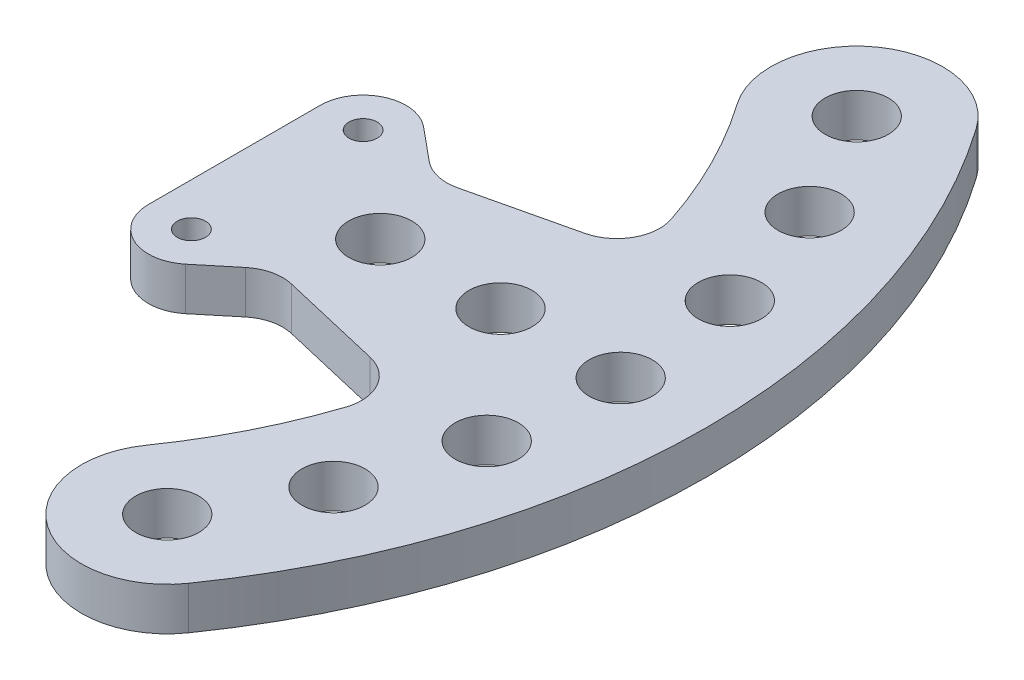
ISO-10303-21;
HEADER;
FILE_DESCRIPTION(('STEP AP214'),'2;1');
FILE_NAME('part.step','',(''),(''),'','','');
FILE_SCHEMA(('AUTOMOTIVE_DESIGN { 1 0 10303 214 1 1 1 1 }'));
ENDSEC;
DATA;
#1=APPLICATION_CONTEXT('core data for automotive mechanical design processes');
#2=APPLICATION_PROTOCOL_DEFINITION('international standard','automotive_design',2000,#1);
#3=PRODUCT_CONTEXT('',#1,'mechanical');
#4=PRODUCT('Part','Part','',(#3));
#5=PRODUCT_RELATED_PRODUCT_CATEGORY('part','',(#4));
#6=PRODUCT_DEFINITION_FORMATION('','',#4);
#7=PRODUCT_DEFINITION_CONTEXT('part definition',#1,'design');
#8=PRODUCT_DEFINITION('design','',#6,#7);
#9=PRODUCT_DEFINITION_SHAPE('','',#8);
#10=(LENGTH_UNIT() NAMED_UNIT(*) SI_UNIT(.MILLI.,.METRE.));
#11=(NAMED_UNIT(*) PLANE_ANGLE_UNIT() SI_UNIT($,.RADIAN.));
#12=(NAMED_UNIT(*) SI_UNIT($,.STERADIAN.) SOLID_ANGLE_UNIT());
#13=UNCERTAINTY_MEASURE_WITH_UNIT(LENGTH_MEASURE(1.E-05),#10,'distance_accuracy_value','');
#14=(GEOMETRIC_REPRESENTATION_CONTEXT(3) GLOBAL_UNCERTAINTY_ASSIGNED_CONTEXT((#13)) GLOBAL_UNIT_ASSIGNED_CONTEXT((#10,
#11,#12)) REPRESENTATION_CONTEXT('',''));
#15=CARTESIAN_POINT('',(0.,0.,0.));
#16=DIRECTION('',(0.,0.,1.));
#17=DIRECTION('',(1.,0.,0.));
#18=AXIS2_PLACEMENT_3D('',#15,#16,#17);
#19=CARTESIAN_POINT('',(72.8226167372916,6.35,50.9909451916076));
#20=DIRECTION('',(0.,1.,0.));
#21=DIRECTION('',(0.,0.,1.));
#22=AXIS2_PLACEMENT_3D('',#19,#20,#21);
#23=PLANE('',#22);
#24=CARTESIAN_POINT('',(71.12,6.35,1.24157076409262E-13));
#25=DIRECTION('',(0.,1.,0.));
#26=DIRECTION('',(0.,0.,1.));
#27=AXIS2_PLACEMENT_3D('',#24,#25,#26);
#28=CIRCLE('',#27,4.6736);
#29=CARTESIAN_POINT('',(71.12,6.35,4.67360000000012));
#30=VERTEX_POINT('',#29);
#31=EDGE_CURVE('E370',#30,#30,#28,.T.);
#32=ORIENTED_EDGE('',*,*,#31,.F.);
#33=EDGE_LOOP('',(#32));
#34=FACE_BOUND('',#33,.T.);
#35=CARTESIAN_POINT('',(81.6294119016563,6.35,-35.2114912008811));
#36=DIRECTION('',(0.,1.,0.));
#37=DIRECTION('',(0.,0.,1.));
#38=AXIS2_PLACEMENT_3D('',#35,#36,#37);
#39=CIRCLE('',#38,4.6736);
#40=CARTESIAN_POINT('',(81.6294119016563,6.35,-30.5378912008811));
#41=VERTEX_POINT('',#40);
#42=EDGE_CURVE('E382',#41,#41,#39,.T.);
#43=ORIENTED_EDGE('',*,*,#42,.F.);
#44=EDGE_LOOP('',(#43));
#45=FACE_BOUND('',#44,.T.);
#46=CARTESIAN_POINT('',(72.8226167372913,6.35,50.9909451916081));
#47=DIRECTION('',(0.,1.,0.));
#48=DIRECTION('',(0.,0.,1.));
#49=AXIS2_PLACEMENT_3D('',#46,#47,#48);
#50=CIRCLE('',#49,4.6736);
#51=CARTESIAN_POINT('',(72.8226167372913,6.35,55.6645451916081));
#52=VERTEX_POINT('',#51);
#53=EDGE_CURVE('E394',#52,#52,#50,.T.);
#54=ORIENTED_EDGE('',*,*,#53,.F.);
#55=EDGE_LOOP('',(#54));
#56=FACE_BOUND('',#55,.T.);
#57=CARTESIAN_POINT('',(87.0633812749575,6.35,17.9771421803182));
#58=DIRECTION('',(0.,1.,0.));
#59=DIRECTION('',(0.,0.,1.));
#60=AXIS2_PLACEMENT_3D('',#57,#58,#59);
#61=CIRCLE('',#60,4.6736);
#62=CARTESIAN_POINT('',(87.0633812749575,6.35,22.6507421803182));
#63=VERTEX_POINT('',#62);
#64=EDGE_CURVE('E406',#63,#63,#61,.T.);
#65=ORIENTED_EDGE('',*,*,#64,.F.);
#66=EDGE_LOOP('',(#65));
#67=FACE_BOUND('',#66,.T.);
#68=CARTESIAN_POINT('',(88.9,6.35,0.));
#69=DIRECTION('',(0.,1.,0.));
#70=DIRECTION('',(0.,0.,1.));
#71=AXIS2_PLACEMENT_3D('',#68,#69,#70);
#72=CIRCLE('',#71,4.6736);
#73=CARTESIAN_POINT('',(88.9,6.35,4.6736));
#74=VERTEX_POINT('',#73);
#75=EDGE_CURVE('E418',#74,#74,#72,.T.);
#76=ORIENTED_EDGE('',*,*,#75,.F.);
#77=EDGE_LOOP('',(#76));
#78=FACE_BOUND('',#77,.T.);
#79=CARTESIAN_POINT('',(72.8226167372916,6.35,50.9909451916076));
#80=DIRECTION('',(0.,1.,0.));
#81=DIRECTION('',(0.,0.,1.));
#82=AXIS2_PLACEMENT_3D('',#79,#80,#81);
#83=CIRCLE('',#82,12.7);
#84=CARTESIAN_POINT('',(62.4193857748214,6.35,43.7065244499494));
#85=VERTEX_POINT('',#84);
#86=CARTESIAN_POINT('',(83.2258476997619,6.35,58.2753659332658));
#87=VERTEX_POINT('',#86);
#88=EDGE_CURVE('E208',#85,#87,#83,.T.);
#89=ORIENTED_EDGE('',*,*,#88,.T.);
#90=CARTESIAN_POINT('',(0.,6.35,0.));
#91=DIRECTION('',(0.,1.,0.));
#92=DIRECTION('',(0.,0.,1.));
#93=AXIS2_PLACEMENT_3D('',#90,#91,#92);
#94=CIRCLE('',#93,101.6);
#95=CARTESIAN_POINT('',(83.2258476997619,6.35,-58.2753659332659));
#96=VERTEX_POINT('',#95);
#97=EDGE_CURVE('E116',#87,#96,#94,.T.);
#98=ORIENTED_EDGE('',*,*,#97,.T.);
#99=CARTESIAN_POINT('',(72.8226167372916,6.35,-50.9909451916076));
#100=DIRECTION('',(0.,1.,0.));
#101=DIRECTION('',(0.,0.,1.));
#102=AXIS2_PLACEMENT_3D('',#99,#100,#101);
#103=CIRCLE('',#102,12.7);
#104=CARTESIAN_POINT('',(62.4193857748214,6.35,-43.7065244499494));
#105=VERTEX_POINT('',#104);
#106=EDGE_CURVE('E247',#96,#105,#103,.T.);
#107=ORIENTED_EDGE('',*,*,#106,.T.);
#108=CARTESIAN_POINT('',(0.,6.35,0.));
#109=DIRECTION('',(0.,-1.,0.));
#110=DIRECTION('',(0.,0.,1.));
#111=AXIS2_PLACEMENT_3D('',#108,#109,#110);
#112=CIRCLE('',#111,76.2);
#113=CARTESIAN_POINT('',(72.300962181149,6.35,-24.0626446526572));
#114=VERTEX_POINT('',#113);
#115=EDGE_CURVE('E266',#105,#114,#112,.T.);
#116=ORIENTED_EDGE('',*,*,#115,.T.);
#117=CARTESIAN_POINT('',(66.2758819993866,6.35,-22.0574242649358));
#118=DIRECTION('',(0.,-1.,0.));
#119=DIRECTION('',(0.,0.,-1.));
#120=AXIS2_PLACEMENT_3D('',#117,#118,#119);
#121=CIRCLE('',#120,6.34999999999999);
#122=CARTESIAN_POINT('',(67.7250645994524,6.35,-15.875));
#123=VERTEX_POINT('',#122);
#124=EDGE_CURVE('E263',#114,#123,#121,.T.);
#125=ORIENTED_EDGE('',*,*,#124,.T.);
#126=DIRECTION('',(-0.973610120462327,0.,0.22821773229382));
#127=VECTOR('',#126,1.);
#128=CARTESIAN_POINT('',(67.7250645994524,6.35,-15.875));
#129=LINE('',#128,#127);
#130=CARTESIAN_POINT('',(52.48464211322,6.35,-12.3025898679483));
#131=VERTEX_POINT('',#130);
#132=EDGE_CURVE('E265',#123,#131,#129,.T.);
#133=ORIENTED_EDGE('',*,*,#132,.T.);
#134=CARTESIAN_POINT('',(51.0354595131542,6.35,-18.4850141328841));
#135=DIRECTION('',(0.,-1.,0.));
#136=DIRECTION('',(0.,0.,1.));
#137=AXIS2_PLACEMENT_3D('',#134,#135,#136);
#138=CIRCLE('',#137,6.35000000000001);
#139=CARTESIAN_POINT('',(46.99,6.35,-13.590450073907));
#140=VERTEX_POINT('',#139);
#141=EDGE_CURVE('E268',#131,#140,#138,.T.);
#142=ORIENTED_EDGE('',*,*,#141,.T.);
#143=DIRECTION('',(-0.770797489602684,0.,-0.637080238292007));
#144=VECTOR('',#143,1.);
#145=CARTESIAN_POINT('',(46.99,6.35,-13.590450073907));
#146=LINE('',#145,#144);
#147=CARTESIAN_POINT('',(42.1454595131542,6.35,-17.594564058977));
#148=VERTEX_POINT('',#147);
#149=EDGE_CURVE('E274',#140,#148,#146,.T.);
#150=ORIENTED_EDGE('',*,*,#149,.T.);
#151=CARTESIAN_POINT('',(38.1,6.35,-12.7));
#152=DIRECTION('',(0.,1.,0.));
#153=DIRECTION('',(0.,0.,1.));
#154=AXIS2_PLACEMENT_3D('',#151,#152,#153);
#155=CIRCLE('',#154,6.35);
#156=CARTESIAN_POINT('',(31.75,6.35,-12.7));
#157=VERTEX_POINT('',#156);
#158=EDGE_CURVE('E276',#148,#157,#155,.T.);
#159=ORIENTED_EDGE('',*,*,#158,.T.);
#160=DIRECTION('',(0.,0.,1.));
#161=VECTOR('',#160,1.);
#162=CARTESIAN_POINT('',(31.75,6.35,-12.7));
#163=LINE('',#162,#161);
#164=CARTESIAN_POINT('',(31.75,6.35,12.7));
#165=VERTEX_POINT('',#164);
#166=EDGE_CURVE('E278',#157,#165,#163,.T.);
#167=ORIENTED_EDGE('',*,*,#166,.T.);
#168=CARTESIAN_POINT('',(38.1,6.35,12.7));
#169=DIRECTION('',(0.,1.,0.));
#170=DIRECTION('',(0.,0.,-1.));
#171=AXIS2_PLACEMENT_3D('',#168,#169,#170);
#172=CIRCLE('',#171,6.35);
#173=CARTESIAN_POINT('',(42.1454595131542,6.35,17.594564058977));
#174=VERTEX_POINT('',#173);
#175=EDGE_CURVE('E280',#165,#174,#172,.T.);
#176=ORIENTED_EDGE('',*,*,#175,.T.);
#177=DIRECTION('',(0.770797489602684,0.,-0.637080238292007));
#178=VECTOR('',#177,1.);
#179=CARTESIAN_POINT('',(46.99,6.35,13.590450073907));
#180=LINE('',#179,#178);
#181=CARTESIAN_POINT('',(46.99,6.35,13.590450073907));
#182=VERTEX_POINT('',#181);
#183=EDGE_CURVE('E282',#174,#182,#180,.T.);
#184=ORIENTED_EDGE('',*,*,#183,.T.);
#185=CARTESIAN_POINT('',(51.0354595131542,6.35,18.4850141328841));
#186=DIRECTION('',(0.,-1.,0.));
#187=DIRECTION('',(0.,0.,-1.));
#188=AXIS2_PLACEMENT_3D('',#185,#186,#187);
#189=CIRCLE('',#188,6.35000000000001);
#190=CARTESIAN_POINT('',(52.48464211322,6.35,12.3025898679483));
#191=VERTEX_POINT('',#190);
#192=EDGE_CURVE('E159',#182,#191,#189,.T.);
#193=ORIENTED_EDGE('',*,*,#192,.T.);
#194=DIRECTION('',(0.973610120462327,0.,0.22821773229382));
#195=VECTOR('',#194,1.);
#196=CARTESIAN_POINT('',(67.7250645994524,6.35,15.875));
#197=LINE('',#196,#195);
#198=CARTESIAN_POINT('',(67.7250645994524,6.35,15.875));
#199=VERTEX_POINT('',#198);
#200=EDGE_CURVE('E153',#191,#199,#197,.T.);
#201=ORIENTED_EDGE('',*,*,#200,.T.);
#202=CARTESIAN_POINT('',(66.2758819993866,6.35,22.0574242649358));
#203=DIRECTION('',(0.,-1.,0.));
#204=DIRECTION('',(0.,0.,1.));
#205=AXIS2_PLACEMENT_3D('',#202,#203,#204);
#206=CIRCLE('',#205,6.34999999999999);
#207=CARTESIAN_POINT('',(72.300962181149,6.35,24.0626446526572));
#208=VERTEX_POINT('',#207);
#209=EDGE_CURVE('E157',#199,#208,#206,.T.);
#210=ORIENTED_EDGE('',*,*,#209,.T.);
#211=CARTESIAN_POINT('',(0.,6.35,0.));
#212=DIRECTION('',(0.,-1.,0.));
#213=DIRECTION('',(0.,0.,-1.));
#214=AXIS2_PLACEMENT_3D('',#211,#212,#213);
#215=CIRCLE('',#214,76.2);
#216=EDGE_CURVE('E49',#208,#85,#215,.T.);
#217=ORIENTED_EDGE('',*,*,#216,.T.);
#218=EDGE_LOOP('',(#89,#98,#107,#116,#125,#133,#142,#150,#159,#167,#176,#184,#193,#201,#210,#217));
#219=FACE_BOUND('',#218,.T.);
#220=CARTESIAN_POINT('',(38.1,6.35,-12.7));
#221=DIRECTION('',(0.,1.,0.));
#222=DIRECTION('',(0.,0.,1.));
#223=AXIS2_PLACEMENT_3D('',#220,#221,#222);
#224=CIRCLE('',#223,2.0828);
#225=CARTESIAN_POINT('',(38.1,6.35,-10.6172));
#226=VERTEX_POINT('',#225);
#227=EDGE_CURVE('E181',#226,#226,#224,.T.);
#228=ORIENTED_EDGE('',*,*,#227,.F.);
#229=EDGE_LOOP('',(#228));
#230=FACE_BOUND('',#229,.T.);
#231=CARTESIAN_POINT('',(38.1,6.35,12.7));
#232=DIRECTION('',(0.,1.,0.));
#233=DIRECTION('',(0.,0.,-1.));
#234=AXIS2_PLACEMENT_3D('',#231,#232,#233);
#235=CIRCLE('',#234,2.0828);
#236=CARTESIAN_POINT('',(38.1,6.35,10.6172));
#237=VERTEX_POINT('',#236);
#238=EDGE_CURVE('E412',#237,#237,#235,.T.);
#239=ORIENTED_EDGE('',*,*,#238,.F.);
#240=EDGE_LOOP('',(#239));
#241=FACE_BOUND('',#240,.T.);
#242=CARTESIAN_POINT('',(81.6294119016563,6.35,35.2114912008811));
#243=DIRECTION('',(0.,1.,0.));
#244=DIRECTION('',(0.,0.,1.));
#245=AXIS2_PLACEMENT_3D('',#242,#243,#244);
#246=CIRCLE('',#245,4.6736);
#247=CARTESIAN_POINT('',(81.6294119016563,6.35,39.8850912008811));
#248=VERTEX_POINT('',#247);
#249=EDGE_CURVE('E400',#248,#248,#246,.T.);
#250=ORIENTED_EDGE('',*,*,#249,.F.);
#251=EDGE_LOOP('',(#250));
#252=FACE_BOUND('',#251,.T.);
#253=CARTESIAN_POINT('',(87.0633812749575,6.35,-17.9771421803182));
#254=DIRECTION('',(0.,1.,0.));
#255=DIRECTION('',(0.,0.,1.));
#256=AXIS2_PLACEMENT_3D('',#253,#254,#255);
#257=CIRCLE('',#256,4.6736);
#258=CARTESIAN_POINT('',(87.0633812749575,6.35,-13.3035421803182));
#259=VERTEX_POINT('',#258);
#260=EDGE_CURVE('E388',#259,#259,#257,.T.);
#261=ORIENTED_EDGE('',*,*,#260,.F.);
#262=EDGE_LOOP('',(#261));
#263=FACE_BOUND('',#262,.T.);
#264=CARTESIAN_POINT('',(72.8226167372913,6.35,-50.9909451916081));
#265=DIRECTION('',(0.,1.,0.));
#266=DIRECTION('',(0.,0.,1.));
#267=AXIS2_PLACEMENT_3D('',#264,#265,#266);
#268=CIRCLE('',#267,4.6736);
#269=CARTESIAN_POINT('',(72.8226167372913,6.35,-46.3173451916081));
#270=VERTEX_POINT('',#269);
#271=EDGE_CURVE('E376',#270,#270,#268,.T.);
#272=ORIENTED_EDGE('',*,*,#271,.F.);
#273=EDGE_LOOP('',(#272));
#274=FACE_BOUND('',#273,.T.);
#275=CARTESIAN_POINT('',(53.34,6.35,2.48314152818524E-13));
#276=DIRECTION('',(0.,1.,0.));
#277=DIRECTION('',(0.,0.,1.));
#278=AXIS2_PLACEMENT_3D('',#275,#276,#277);
#279=CIRCLE('',#278,4.6736);
#280=CARTESIAN_POINT('',(53.34,6.35,4.67360000000025));
#281=VERTEX_POINT('',#280);
#282=EDGE_CURVE('E361',#281,#281,#279,.T.);
#283=ORIENTED_EDGE('',*,*,#282,.F.);
#284=EDGE_LOOP('',(#283));
#285=FACE_BOUND('',#284,.T.);
#286=ADVANCED_FACE('F32',(#34,#45,#56,#67,#78,#219,#230,#241,#252,#263,#274,#285),#23,.T.);
#287=CARTESIAN_POINT('',(72.8226167372916,0.,50.9909451916076));
#288=DIRECTION('',(0.,1.,0.));
#289=DIRECTION('',(0.,0.,1.));
#290=AXIS2_PLACEMENT_3D('',#287,#288,#289);
#291=PLANE('',#290);
#292=CARTESIAN_POINT('',(72.8226167372916,0.,50.9909451916076));
#293=DIRECTION('',(0.,1.,0.));
#294=DIRECTION('',(0.,0.,1.));
#295=AXIS2_PLACEMENT_3D('',#292,#293,#294);
#296=CIRCLE('',#295,12.7);
#297=CARTESIAN_POINT('',(62.4193857748214,0.,43.7065244499494));
#298=VERTEX_POINT('',#297);
#299=CARTESIAN_POINT('',(83.2258476997619,0.,58.2753659332658));
#300=VERTEX_POINT('',#299);
#301=EDGE_CURVE('E177',#298,#300,#296,.T.);
#302=ORIENTED_EDGE('',*,*,#301,.F.);
#303=CARTESIAN_POINT('',(0.,0.,0.));
#304=DIRECTION('',(0.,-1.,0.));
#305=DIRECTION('',(0.,0.,-1.));
#306=AXIS2_PLACEMENT_3D('',#303,#304,#305);
#307=CIRCLE('',#306,76.2);
#308=CARTESIAN_POINT('',(72.300962181149,0.,24.0626446526572));
#309=VERTEX_POINT('',#308);
#310=EDGE_CURVE('E108',#309,#298,#307,.T.);
#311=ORIENTED_EDGE('',*,*,#310,.F.);
#312=CARTESIAN_POINT('',(66.2758819993866,0.,22.0574242649358));
#313=DIRECTION('',(0.,-1.,0.));
#314=DIRECTION('',(0.,0.,1.));
#315=AXIS2_PLACEMENT_3D('',#312,#313,#314);
#316=CIRCLE('',#315,6.34999999999999);
#317=CARTESIAN_POINT('',(67.7250645994524,0.,15.875));
#318=VERTEX_POINT('',#317);
#319=EDGE_CURVE('E102',#318,#309,#316,.T.);
#320=ORIENTED_EDGE('',*,*,#319,.F.);
#321=DIRECTION('',(0.973610120462327,0.,0.22821773229382));
#322=VECTOR('',#321,1.);
#323=CARTESIAN_POINT('',(67.7250645994524,0.,15.875));
#324=LINE('',#323,#322);
#325=CARTESIAN_POINT('',(52.48464211322,0.,12.3025898679483));
#326=VERTEX_POINT('',#325);
#327=EDGE_CURVE('E167',#326,#318,#324,.T.);
#328=ORIENTED_EDGE('',*,*,#327,.F.);
#329=CARTESIAN_POINT('',(51.0354595131542,0.,18.4850141328841));
#330=DIRECTION('',(0.,-1.,0.));
#331=DIRECTION('',(0.,0.,-1.));
#332=AXIS2_PLACEMENT_3D('',#329,#330,#331);
#333=CIRCLE('',#332,6.35000000000001);
#334=CARTESIAN_POINT('',(46.99,0.,13.590450073907));
#335=VERTEX_POINT('',#334);
#336=EDGE_CURVE('E203',#335,#326,#333,.T.);
#337=ORIENTED_EDGE('',*,*,#336,.F.);
#338=DIRECTION('',(0.770797489602684,0.,-0.637080238292007));
#339=VECTOR('',#338,1.);
#340=CARTESIAN_POINT('',(46.99,0.,13.590450073907));
#341=LINE('',#340,#339);
#342=CARTESIAN_POINT('',(42.1454595131542,0.,17.594564058977));
#343=VERTEX_POINT('',#342);
#344=EDGE_CURVE('E201',#343,#335,#341,.T.);
#345=ORIENTED_EDGE('',*,*,#344,.F.);
#346=CARTESIAN_POINT('',(38.1,0.,12.7));
#347=DIRECTION('',(0.,1.,0.));
#348=DIRECTION('',(0.,0.,-1.));
#349=AXIS2_PLACEMENT_3D('',#346,#347,#348);
#350=CIRCLE('',#349,6.35);
#351=CARTESIAN_POINT('',(31.75,0.,12.7));
#352=VERTEX_POINT('',#351);
#353=EDGE_CURVE('E199',#352,#343,#350,.T.);
#354=ORIENTED_EDGE('',*,*,#353,.F.);
#355=DIRECTION('',(0.,0.,1.));
#356=VECTOR('',#355,1.);
#357=CARTESIAN_POINT('',(31.75,0.,-12.7));
#358=LINE('',#357,#356);
#359=CARTESIAN_POINT('',(31.75,0.,-12.7));
#360=VERTEX_POINT('',#359);
#361=EDGE_CURVE('E197',#360,#352,#358,.T.);
#362=ORIENTED_EDGE('',*,*,#361,.F.);
#363=CARTESIAN_POINT('',(38.1,0.,-12.7));
#364=DIRECTION('',(0.,1.,0.));
#365=DIRECTION('',(0.,0.,1.));
#366=AXIS2_PLACEMENT_3D('',#363,#364,#365);
#367=CIRCLE('',#366,6.35);
#368=CARTESIAN_POINT('',(42.1454595131542,0.,-17.594564058977));
#369=VERTEX_POINT('',#368);
#370=EDGE_CURVE('E195',#369,#360,#367,.T.);
#371=ORIENTED_EDGE('',*,*,#370,.F.);
#372=DIRECTION('',(-0.770797489602684,0.,-0.637080238292007));
#373=VECTOR('',#372,1.);
#374=CARTESIAN_POINT('',(46.99,0.,-13.590450073907));
#375=LINE('',#374,#373);
#376=CARTESIAN_POINT('',(46.99,0.,-13.590450073907));
#377=VERTEX_POINT('',#376);
#378=EDGE_CURVE('E193',#377,#369,#375,.T.);
#379=ORIENTED_EDGE('',*,*,#378,.F.);
#380=CARTESIAN_POINT('',(51.0354595131542,0.,-18.4850141328841));
#381=DIRECTION('',(0.,-1.,0.));
#382=DIRECTION('',(0.,0.,1.));
#383=AXIS2_PLACEMENT_3D('',#380,#381,#382);
#384=CIRCLE('',#383,6.35000000000001);
#385=CARTESIAN_POINT('',(52.48464211322,0.,-12.3025898679483));
#386=VERTEX_POINT('',#385);
#387=EDGE_CURVE('E191',#386,#377,#384,.T.);
#388=ORIENTED_EDGE('',*,*,#387,.F.);
#389=DIRECTION('',(-0.973610120462327,0.,0.22821773229382));
#390=VECTOR('',#389,1.);
#391=CARTESIAN_POINT('',(67.7250645994524,0.,-15.875));
#392=LINE('',#391,#390);
#393=CARTESIAN_POINT('',(67.7250645994524,0.,-15.875));
#394=VERTEX_POINT('',#393);
#395=EDGE_CURVE('E189',#394,#386,#392,.T.);
#396=ORIENTED_EDGE('',*,*,#395,.F.);
#397=CARTESIAN_POINT('',(66.2758819993866,0.,-22.0574242649358));
#398=DIRECTION('',(0.,-1.,0.));
#399=DIRECTION('',(0.,0.,-1.));
#400=AXIS2_PLACEMENT_3D('',#397,#398,#399);
#401=CIRCLE('',#400,6.34999999999999);
#402=CARTESIAN_POINT('',(72.300962181149,0.,-24.0626446526572));
#403=VERTEX_POINT('',#402);
#404=EDGE_CURVE('E187',#403,#394,#401,.T.);
#405=ORIENTED_EDGE('',*,*,#404,.F.);
#406=CARTESIAN_POINT('',(0.,0.,0.));
#407=DIRECTION('',(0.,-1.,0.));
#408=DIRECTION('',(0.,0.,1.));
#409=AXIS2_PLACEMENT_3D('',#406,#407,#408);
#410=CIRCLE('',#409,76.2);
#411=CARTESIAN_POINT('',(62.4193857748214,0.,-43.7065244499494));
#412=VERTEX_POINT('',#411);
#413=EDGE_CURVE('E185',#412,#403,#410,.T.);
#414=ORIENTED_EDGE('',*,*,#413,.F.);
#415=CARTESIAN_POINT('',(72.8226167372916,0.,-50.9909451916076));
#416=DIRECTION('',(0.,1.,0.));
#417=DIRECTION('',(0.,0.,1.));
#418=AXIS2_PLACEMENT_3D('',#415,#416,#417);
#419=CIRCLE('',#418,12.7);
#420=CARTESIAN_POINT('',(83.2258476997619,0.,-58.2753659332659));
#421=VERTEX_POINT('',#420);
#422=EDGE_CURVE('E183',#421,#412,#419,.T.);
#423=ORIENTED_EDGE('',*,*,#422,.F.);
#424=CARTESIAN_POINT('',(0.,0.,0.));
#425=DIRECTION('',(0.,1.,0.));
#426=DIRECTION('',(0.,0.,1.));
#427=AXIS2_PLACEMENT_3D('',#424,#425,#426);
#428=CIRCLE('',#427,101.6);
#429=EDGE_CURVE('E180',#300,#421,#428,.T.);
#430=ORIENTED_EDGE('',*,*,#429,.F.);
#431=EDGE_LOOP('',(#302,#311,#320,#328,#337,#345,#354,#362,#371,#379,#388,#396,#405,#414,#423,#430));
#432=FACE_BOUND('',#431,.T.);
#433=CARTESIAN_POINT('',(38.1,0.,-12.7));
#434=DIRECTION('',(0.,1.,0.));
#435=DIRECTION('',(0.,0.,1.));
#436=AXIS2_PLACEMENT_3D('',#433,#434,#435);
#437=CIRCLE('',#436,2.0828);
#438=CARTESIAN_POINT('',(38.1,0.,-10.6172));
#439=VERTEX_POINT('',#438);
#440=EDGE_CURVE('E421',#439,#439,#437,.T.);
#441=ORIENTED_EDGE('',*,*,#440,.T.);
#442=EDGE_LOOP('',(#441));
#443=FACE_BOUND('',#442,.T.);
#444=CARTESIAN_POINT('',(88.9,0.,0.));
#445=DIRECTION('',(0.,1.,0.));
#446=DIRECTION('',(0.,0.,1.));
#447=AXIS2_PLACEMENT_3D('',#444,#445,#446);
#448=CIRCLE('',#447,4.6736);
#449=CARTESIAN_POINT('',(88.9,0.,4.6736));
#450=VERTEX_POINT('',#449);
#451=EDGE_CURVE('E415',#450,#450,#448,.T.);
#452=ORIENTED_EDGE('',*,*,#451,.T.);
#453=EDGE_LOOP('',(#452));
#454=FACE_BOUND('',#453,.T.);
#455=CARTESIAN_POINT('',(38.1,0.,12.7));
#456=DIRECTION('',(0.,1.,0.));
#457=DIRECTION('',(0.,0.,-1.));
#458=AXIS2_PLACEMENT_3D('',#455,#456,#457);
#459=CIRCLE('',#458,2.0828);
#460=CARTESIAN_POINT('',(38.1,0.,10.6172));
#461=VERTEX_POINT('',#460);
#462=EDGE_CURVE('E409',#461,#461,#459,.T.);
#463=ORIENTED_EDGE('',*,*,#462,.T.);
#464=EDGE_LOOP('',(#463));
#465=FACE_BOUND('',#464,.T.);
#466=CARTESIAN_POINT('',(87.0633812749575,0.,17.9771421803182));
#467=DIRECTION('',(0.,1.,0.));
#468=DIRECTION('',(0.,0.,1.));
#469=AXIS2_PLACEMENT_3D('',#466,#467,#468);
#470=CIRCLE('',#469,4.6736);
#471=CARTESIAN_POINT('',(87.0633812749575,0.,22.6507421803182));
#472=VERTEX_POINT('',#471);
#473=EDGE_CURVE('E403',#472,#472,#470,.T.);
#474=ORIENTED_EDGE('',*,*,#473,.T.);
#475=EDGE_LOOP('',(#474));
#476=FACE_BOUND('',#475,.T.);
#477=CARTESIAN_POINT('',(81.6294119016563,0.,35.2114912008811));
#478=DIRECTION('',(0.,1.,0.));
#479=DIRECTION('',(0.,0.,1.));
#480=AXIS2_PLACEMENT_3D('',#477,#478,#479);
#481=CIRCLE('',#480,4.6736);
#482=CARTESIAN_POINT('',(81.6294119016563,0.,39.8850912008811));
#483=VERTEX_POINT('',#482);
#484=EDGE_CURVE('E397',#483,#483,#481,.T.);
#485=ORIENTED_EDGE('',*,*,#484,.T.);
#486=EDGE_LOOP('',(#485));
#487=FACE_BOUND('',#486,.T.);
#488=CARTESIAN_POINT('',(72.8226167372913,0.,50.9909451916081));
#489=DIRECTION('',(0.,1.,0.));
#490=DIRECTION('',(0.,0.,1.));
#491=AXIS2_PLACEMENT_3D('',#488,#489,#490);
#492=CIRCLE('',#491,4.6736);
#493=CARTESIAN_POINT('',(72.8226167372913,0.,55.6645451916081));
#494=VERTEX_POINT('',#493);
#495=EDGE_CURVE('E391',#494,#494,#492,.T.);
#496=ORIENTED_EDGE('',*,*,#495,.T.);
#497=EDGE_LOOP('',(#496));
#498=FACE_BOUND('',#497,.T.);
#499=CARTESIAN_POINT('',(87.0633812749575,0.,-17.9771421803182));
#500=DIRECTION('',(0.,1.,0.));
#501=DIRECTION('',(0.,0.,1.));
#502=AXIS2_PLACEMENT_3D('',#499,#500,#501);
#503=CIRCLE('',#502,4.6736);
#504=CARTESIAN_POINT('',(87.0633812749575,0.,-13.3035421803182));
#505=VERTEX_POINT('',#504);
#506=EDGE_CURVE('E385',#505,#505,#503,.T.);
#507=ORIENTED_EDGE('',*,*,#506,.T.);
#508=EDGE_LOOP('',(#507));
#509=FACE_BOUND('',#508,.T.);
#510=CARTESIAN_POINT('',(81.6294119016563,0.,-35.2114912008811));
#511=DIRECTION('',(0.,1.,0.));
#512=DIRECTION('',(0.,0.,1.));
#513=AXIS2_PLACEMENT_3D('',#510,#511,#512);
#514=CIRCLE('',#513,4.6736);
#515=CARTESIAN_POINT('',(81.6294119016563,0.,-30.5378912008811));
#516=VERTEX_POINT('',#515);
#517=EDGE_CURVE('E379',#516,#516,#514,.T.);
#518=ORIENTED_EDGE('',*,*,#517,.T.);
#519=EDGE_LOOP('',(#518));
#520=FACE_BOUND('',#519,.T.);
#521=CARTESIAN_POINT('',(72.8226167372913,0.,-50.9909451916081));
#522=DIRECTION('',(0.,1.,0.));
#523=DIRECTION('',(0.,0.,1.));
#524=AXIS2_PLACEMENT_3D('',#521,#522,#523);
#525=CIRCLE('',#524,4.6736);
#526=CARTESIAN_POINT('',(72.8226167372913,0.,-46.3173451916081));
#527=VERTEX_POINT('',#526);
#528=EDGE_CURVE('E373',#527,#527,#525,.T.);
#529=ORIENTED_EDGE('',*,*,#528,.T.);
#530=EDGE_LOOP('',(#529));
#531=FACE_BOUND('',#530,.T.);
#532=CARTESIAN_POINT('',(71.12,0.,1.24157076409262E-13));
#533=DIRECTION('',(0.,1.,0.));
#534=DIRECTION('',(0.,0.,1.));
#535=AXIS2_PLACEMENT_3D('',#532,#533,#534);
#536=CIRCLE('',#535,4.6736);
#537=CARTESIAN_POINT('',(71.12,0.,4.67360000000012));
#538=VERTEX_POINT('',#537);
#539=EDGE_CURVE('E367',#538,#538,#536,.T.);
#540=ORIENTED_EDGE('',*,*,#539,.T.);
#541=EDGE_LOOP('',(#540));
#542=FACE_BOUND('',#541,.T.);
#543=CARTESIAN_POINT('',(53.34,0.,2.48314152818524E-13));
#544=DIRECTION('',(0.,1.,0.));
#545=DIRECTION('',(0.,0.,1.));
#546=AXIS2_PLACEMENT_3D('',#543,#544,#545);
#547=CIRCLE('',#546,4.6736);
#548=CARTESIAN_POINT('',(53.34,0.,4.67360000000025));
#549=VERTEX_POINT('',#548);
#550=EDGE_CURVE('E364',#549,#549,#547,.T.);
#551=ORIENTED_EDGE('',*,*,#550,.T.);
#552=EDGE_LOOP('',(#551));
#553=FACE_BOUND('',#552,.T.);
#554=ADVANCED_FACE('F251',(#432,#443,#454,#465,#476,#487,#498,#509,#520,#531,#542,#553),#291,.F.);
#555=CARTESIAN_POINT('',(72.8226167372916,6.35,50.9909451916076));
#556=DIRECTION('',(0.,-1.,0.));
#557=DIRECTION('',(0.,0.,-1.));
#558=AXIS2_PLACEMENT_3D('',#555,#556,#557);
#559=CYLINDRICAL_SURFACE('',#558,12.7);
#560=ORIENTED_EDGE('',*,*,#301,.T.);
#561=DIRECTION('',(0.,-1.,0.));
#562=VECTOR('',#561,1.);
#563=CARTESIAN_POINT('',(83.2258476997619,6.35,58.2753659332658));
#564=LINE('',#563,#562);
#565=EDGE_CURVE('E11',#87,#300,#564,.T.);
#566=ORIENTED_EDGE('',*,*,#565,.F.);
#567=ORIENTED_EDGE('',*,*,#88,.F.);
#568=DIRECTION('',(0.,-1.,0.));
#569=VECTOR('',#568,1.);
#570=CARTESIAN_POINT('',(62.4193857748214,6.35,43.7065244499494));
#571=LINE('',#570,#569);
#572=EDGE_CURVE('E173',#85,#298,#571,.T.);
#573=ORIENTED_EDGE('',*,*,#572,.T.);
#574=EDGE_LOOP('',(#560,#566,#567,#573));
#575=FACE_BOUND('',#574,.T.);
#576=ADVANCED_FACE('F34',(#575),#559,.T.);
#577=CARTESIAN_POINT('',(0.,6.35,0.));
#578=DIRECTION('',(0.,-1.,0.));
#579=DIRECTION('',(0.,0.,-1.));
#580=AXIS2_PLACEMENT_3D('',#577,#578,#579);
#581=CYLINDRICAL_SURFACE('',#580,101.6);
#582=ORIENTED_EDGE('',*,*,#429,.T.);
#583=DIRECTION('',(0.,-1.,0.));
#584=VECTOR('',#583,1.);
#585=CARTESIAN_POINT('',(83.2258476997619,6.35,-58.2753659332659));
#586=LINE('',#585,#584);
#587=EDGE_CURVE('E41',#96,#421,#586,.T.);
#588=ORIENTED_EDGE('',*,*,#587,.F.);
#589=ORIENTED_EDGE('',*,*,#97,.F.);
#590=ORIENTED_EDGE('',*,*,#565,.T.);
#591=EDGE_LOOP('',(#582,#588,#589,#590));
#592=FACE_BOUND('',#591,.T.);
#593=ADVANCED_FACE('F634',(#592),#581,.T.);
#594=CARTESIAN_POINT('',(72.8226167372916,6.35,-50.9909451916076));
#595=DIRECTION('',(0.,-1.,0.));
#596=DIRECTION('',(0.,0.,-1.));
#597=AXIS2_PLACEMENT_3D('',#594,#595,#596);
#598=CYLINDRICAL_SURFACE('',#597,12.7);
#599=ORIENTED_EDGE('',*,*,#422,.T.);
#600=DIRECTION('',(0.,-1.,0.));
#601=VECTOR('',#600,1.);
#602=CARTESIAN_POINT('',(62.4193857748214,6.35,-43.7065244499494));
#603=LINE('',#602,#601);
#604=EDGE_CURVE('E239',#105,#412,#603,.T.);
#605=ORIENTED_EDGE('',*,*,#604,.F.);
#606=ORIENTED_EDGE('',*,*,#106,.F.);
#607=ORIENTED_EDGE('',*,*,#587,.T.);
#608=EDGE_LOOP('',(#599,#605,#606,#607));
#609=FACE_BOUND('',#608,.T.);
#610=ADVANCED_FACE('F245',(#609),#598,.T.);
#611=CARTESIAN_POINT('',(0.,6.35,0.));
#612=DIRECTION('',(0.,-1.,0.));
#613=DIRECTION('',(0.,0.,-1.));
#614=AXIS2_PLACEMENT_3D('',#611,#612,#613);
#615=CYLINDRICAL_SURFACE('',#614,76.2);
#616=ORIENTED_EDGE('',*,*,#413,.T.);
#617=DIRECTION('',(0.,-1.,0.));
#618=VECTOR('',#617,1.);
#619=CARTESIAN_POINT('',(72.300962181149,6.35,-24.0626446526572));
#620=LINE('',#619,#618);
#621=EDGE_CURVE('E236',#114,#403,#620,.T.);
#622=ORIENTED_EDGE('',*,*,#621,.F.);
#623=ORIENTED_EDGE('',*,*,#115,.F.);
#624=ORIENTED_EDGE('',*,*,#604,.T.);
#625=EDGE_LOOP('',(#616,#622,#623,#624));
#626=FACE_BOUND('',#625,.T.);
#627=ADVANCED_FACE('F257',(#626),#615,.F.);
#628=CARTESIAN_POINT('',(66.2758819993866,6.35,-22.0574242649358));
#629=DIRECTION('',(0.,-1.,0.));
#630=DIRECTION('',(0.,0.,-1.));
#631=AXIS2_PLACEMENT_3D('',#628,#629,#630);
#632=CYLINDRICAL_SURFACE('',#631,6.34999999999999);
#633=ORIENTED_EDGE('',*,*,#404,.T.);
#634=DIRECTION('',(0.,-1.,0.));
#635=VECTOR('',#634,1.);
#636=CARTESIAN_POINT('',(67.7250645994524,6.35,-15.875));
#637=LINE('',#636,#635);
#638=EDGE_CURVE('E233',#123,#394,#637,.T.);
#639=ORIENTED_EDGE('',*,*,#638,.F.);
#640=ORIENTED_EDGE('',*,*,#124,.F.);
#641=ORIENTED_EDGE('',*,*,#621,.T.);
#642=EDGE_LOOP('',(#633,#639,#640,#641));
#643=FACE_BOUND('',#642,.T.);
#644=ADVANCED_FACE('F261',(#643),#632,.F.);
#645=CARTESIAN_POINT('',(67.7250645994524,6.35,-15.875));
#646=DIRECTION('',(0.22821773229382,0.,0.973610120462327));
#647=DIRECTION('',(0.973610120462327,0.,-0.22821773229382));
#648=AXIS2_PLACEMENT_3D('',#645,#646,#647);
#649=PLANE('',#648);
#650=ORIENTED_EDGE('',*,*,#395,.T.);
#651=DIRECTION('',(0.,-1.,0.));
#652=VECTOR('',#651,1.);
#653=CARTESIAN_POINT('',(52.48464211322,6.35,-12.3025898679483));
#654=LINE('',#653,#652);
#655=EDGE_CURVE('E230',#131,#386,#654,.T.);
#656=ORIENTED_EDGE('',*,*,#655,.F.);
#657=ORIENTED_EDGE('',*,*,#132,.F.);
#658=ORIENTED_EDGE('',*,*,#638,.T.);
#659=EDGE_LOOP('',(#650,#656,#657,#658));
#660=FACE_BOUND('',#659,.T.);
#661=ADVANCED_FACE('F599',(#660),#649,.F.);
#662=CARTESIAN_POINT('',(51.0354595131542,6.35,-18.4850141328841));
#663=DIRECTION('',(0.,-1.,0.));
#664=DIRECTION('',(0.,0.,-1.));
#665=AXIS2_PLACEMENT_3D('',#662,#663,#664);
#666=CYLINDRICAL_SURFACE('',#665,6.35000000000001);
#667=ORIENTED_EDGE('',*,*,#387,.T.);
#668=DIRECTION('',(0.,-1.,0.));
#669=VECTOR('',#668,1.);
#670=CARTESIAN_POINT('',(46.99,6.35,-13.590450073907));
#671=LINE('',#670,#669);
#672=EDGE_CURVE('E227',#140,#377,#671,.T.);
#673=ORIENTED_EDGE('',*,*,#672,.F.);
#674=ORIENTED_EDGE('',*,*,#141,.F.);
#675=ORIENTED_EDGE('',*,*,#655,.T.);
#676=EDGE_LOOP('',(#667,#673,#674,#675));
#677=FACE_BOUND('',#676,.T.);
#678=ADVANCED_FACE('F589',(#677),#666,.F.);
#679=CARTESIAN_POINT('',(46.99,6.35,-13.590450073907));
#680=DIRECTION('',(-0.637080238292007,0.,0.770797489602684));
#681=DIRECTION('',(0.770797489602684,0.,0.637080238292007));
#682=AXIS2_PLACEMENT_3D('',#679,#680,#681);
#683=PLANE('',#682);
#684=ORIENTED_EDGE('',*,*,#378,.T.);
#685=DIRECTION('',(0.,-1.,0.));
#686=VECTOR('',#685,1.);
#687=CARTESIAN_POINT('',(42.1454595131542,6.35,-17.594564058977));
#688=LINE('',#687,#686);
#689=EDGE_CURVE('E224',#148,#369,#688,.T.);
#690=ORIENTED_EDGE('',*,*,#689,.F.);
#691=ORIENTED_EDGE('',*,*,#149,.F.);
#692=ORIENTED_EDGE('',*,*,#672,.T.);
#693=EDGE_LOOP('',(#684,#690,#691,#692));
#694=FACE_BOUND('',#693,.T.);
#695=ADVANCED_FACE('F579',(#694),#683,.F.);
#696=CARTESIAN_POINT('',(38.1,6.35,-12.7));
#697=DIRECTION('',(0.,-1.,0.));
#698=DIRECTION('',(0.,0.,-1.));
#699=AXIS2_PLACEMENT_3D('',#696,#697,#698);
#700=CYLINDRICAL_SURFACE('',#699,6.35);
#701=ORIENTED_EDGE('',*,*,#370,.T.);
#702=DIRECTION('',(0.,-1.,0.));
#703=VECTOR('',#702,1.);
#704=CARTESIAN_POINT('',(31.75,6.35,-12.7));
#705=LINE('',#704,#703);
#706=EDGE_CURVE('E221',#157,#360,#705,.T.);
#707=ORIENTED_EDGE('',*,*,#706,.F.);
#708=ORIENTED_EDGE('',*,*,#158,.F.);
#709=ORIENTED_EDGE('',*,*,#689,.T.);
#710=EDGE_LOOP('',(#701,#707,#708,#709));
#711=FACE_BOUND('',#710,.T.);
#712=ADVANCED_FACE('F569',(#711),#700,.T.);
#713=CARTESIAN_POINT('',(31.75,6.35,-12.7));
#714=DIRECTION('',(1.,0.,0.));
#715=DIRECTION('',(0.,0.,-1.));
#716=AXIS2_PLACEMENT_3D('',#713,#714,#715);
#717=PLANE('',#716);
#718=ORIENTED_EDGE('',*,*,#361,.T.);
#719=DIRECTION('',(0.,-1.,0.));
#720=VECTOR('',#719,1.);
#721=CARTESIAN_POINT('',(31.75,6.35,12.7));
#722=LINE('',#721,#720);
#723=EDGE_CURVE('E218',#165,#352,#722,.T.);
#724=ORIENTED_EDGE('',*,*,#723,.F.);
#725=ORIENTED_EDGE('',*,*,#166,.F.);
#726=ORIENTED_EDGE('',*,*,#706,.T.);
#727=EDGE_LOOP('',(#718,#724,#725,#726));
#728=FACE_BOUND('',#727,.T.);
#729=ADVANCED_FACE('F559',(#728),#717,.F.);
#730=CARTESIAN_POINT('',(38.1,6.35,12.7));
#731=DIRECTION('',(0.,-1.,0.));
#732=DIRECTION('',(0.,0.,-1.));
#733=AXIS2_PLACEMENT_3D('',#730,#731,#732);
#734=CYLINDRICAL_SURFACE('',#733,6.35);
#735=ORIENTED_EDGE('',*,*,#353,.T.);
#736=DIRECTION('',(0.,-1.,0.));
#737=VECTOR('',#736,1.);
#738=CARTESIAN_POINT('',(42.1454595131542,6.35,17.594564058977));
#739=LINE('',#738,#737);
#740=EDGE_CURVE('E215',#174,#343,#739,.T.);
#741=ORIENTED_EDGE('',*,*,#740,.F.);
#742=ORIENTED_EDGE('',*,*,#175,.F.);
#743=ORIENTED_EDGE('',*,*,#723,.T.);
#744=EDGE_LOOP('',(#735,#741,#742,#743));
#745=FACE_BOUND('',#744,.T.);
#746=ADVANCED_FACE('F550',(#745),#734,.T.);
#747=CARTESIAN_POINT('',(46.99,6.35,13.590450073907));
#748=DIRECTION('',(-0.637080238292007,0.,-0.770797489602684));
#749=DIRECTION('',(-0.770797489602684,0.,0.637080238292007));
#750=AXIS2_PLACEMENT_3D('',#747,#748,#749);
#751=PLANE('',#750);
#752=ORIENTED_EDGE('',*,*,#344,.T.);
#753=DIRECTION('',(0.,-1.,0.));
#754=VECTOR('',#753,1.);
#755=CARTESIAN_POINT('',(46.99,6.35,13.590450073907));
#756=LINE('',#755,#754);
#757=EDGE_CURVE('E212',#182,#335,#756,.T.);
#758=ORIENTED_EDGE('',*,*,#757,.F.);
#759=ORIENTED_EDGE('',*,*,#183,.F.);
#760=ORIENTED_EDGE('',*,*,#740,.T.);
#761=EDGE_LOOP('',(#752,#758,#759,#760));
#762=FACE_BOUND('',#761,.T.);
#763=ADVANCED_FACE('F288',(#762),#751,.F.);
#764=CARTESIAN_POINT('',(51.0354595131542,6.35,18.4850141328841));
#765=DIRECTION('',(0.,-1.,0.));
#766=DIRECTION('',(0.,0.,-1.));
#767=AXIS2_PLACEMENT_3D('',#764,#765,#766);
#768=CYLINDRICAL_SURFACE('',#767,6.35000000000001);
#769=ORIENTED_EDGE('',*,*,#336,.T.);
#770=DIRECTION('',(0.,-1.,0.));
#771=VECTOR('',#770,1.);
#772=CARTESIAN_POINT('',(52.48464211322,6.35,12.3025898679483));
#773=LINE('',#772,#771);
#774=EDGE_CURVE('E168',#191,#326,#773,.T.);
#775=ORIENTED_EDGE('',*,*,#774,.F.);
#776=ORIENTED_EDGE('',*,*,#192,.F.);
#777=ORIENTED_EDGE('',*,*,#757,.T.);
#778=EDGE_LOOP('',(#769,#775,#776,#777));
#779=FACE_BOUND('',#778,.T.);
#780=ADVANCED_FACE('F292',(#779),#768,.F.);
#781=CARTESIAN_POINT('',(67.7250645994524,6.35,15.875));
#782=DIRECTION('',(0.22821773229382,0.,-0.973610120462327));
#783=DIRECTION('',(-0.973610120462327,0.,-0.22821773229382));
#784=AXIS2_PLACEMENT_3D('',#781,#782,#783);
#785=PLANE('',#784);
#786=ORIENTED_EDGE('',*,*,#327,.T.);
#787=DIRECTION('',(0.,-1.,0.));
#788=VECTOR('',#787,1.);
#789=CARTESIAN_POINT('',(67.7250645994524,6.35,15.875));
#790=LINE('',#789,#788);
#791=EDGE_CURVE('E164',#199,#318,#790,.T.);
#792=ORIENTED_EDGE('',*,*,#791,.F.);
#793=ORIENTED_EDGE('',*,*,#200,.F.);
#794=ORIENTED_EDGE('',*,*,#774,.T.);
#795=EDGE_LOOP('',(#786,#792,#793,#794));
#796=FACE_BOUND('',#795,.T.);
#797=ADVANCED_FACE('F165',(#796),#785,.F.);
#798=CARTESIAN_POINT('',(66.2758819993866,6.35,22.0574242649358));
#799=DIRECTION('',(0.,-1.,0.));
#800=DIRECTION('',(0.,0.,-1.));
#801=AXIS2_PLACEMENT_3D('',#798,#799,#800);
#802=CYLINDRICAL_SURFACE('',#801,6.34999999999999);
#803=ORIENTED_EDGE('',*,*,#319,.T.);
#804=DIRECTION('',(0.,-1.,0.));
#805=VECTOR('',#804,1.);
#806=CARTESIAN_POINT('',(72.300962181149,6.35,24.0626446526572));
#807=LINE('',#806,#805);
#808=EDGE_CURVE('E169',#208,#309,#807,.T.);
#809=ORIENTED_EDGE('',*,*,#808,.F.);
#810=ORIENTED_EDGE('',*,*,#209,.F.);
#811=ORIENTED_EDGE('',*,*,#791,.T.);
#812=EDGE_LOOP('',(#803,#809,#810,#811));
#813=FACE_BOUND('',#812,.T.);
#814=ADVANCED_FACE('F171',(#813),#802,.F.);
#815=CARTESIAN_POINT('',(0.,6.35,0.));
#816=DIRECTION('',(0.,-1.,0.));
#817=DIRECTION('',(0.,0.,-1.));
#818=AXIS2_PLACEMENT_3D('',#815,#816,#817);
#819=CYLINDRICAL_SURFACE('',#818,76.2);
#820=ORIENTED_EDGE('',*,*,#310,.T.);
#821=ORIENTED_EDGE('',*,*,#572,.F.);
#822=ORIENTED_EDGE('',*,*,#216,.F.);
#823=ORIENTED_EDGE('',*,*,#808,.T.);
#824=EDGE_LOOP('',(#820,#821,#822,#823));
#825=FACE_BOUND('',#824,.T.);
#826=ADVANCED_FACE('F296',(#825),#819,.F.);
#827=CARTESIAN_POINT('',(38.1,6.35,-12.7));
#828=DIRECTION('',(0.,-1.,0.));
#829=DIRECTION('',(0.,0.,-1.));
#830=AXIS2_PLACEMENT_3D('',#827,#828,#829);
#831=CYLINDRICAL_SURFACE('',#830,2.0828);
#832=ORIENTED_EDGE('',*,*,#227,.T.);
#833=EDGE_LOOP('',(#832));
#834=FACE_BOUND('',#833,.T.);
#835=ORIENTED_EDGE('',*,*,#440,.F.);
#836=EDGE_LOOP('',(#835));
#837=FACE_BOUND('',#836,.T.);
#838=ADVANCED_FACE('F298',(#834,#837),#831,.F.);
#839=CARTESIAN_POINT('',(88.9,6.35,0.));
#840=DIRECTION('',(0.,-1.,0.));
#841=DIRECTION('',(0.,0.,-1.));
#842=AXIS2_PLACEMENT_3D('',#839,#840,#841);
#843=CYLINDRICAL_SURFACE('',#842,4.6736);
#844=ORIENTED_EDGE('',*,*,#75,.T.);
#845=EDGE_LOOP('',(#844));
#846=FACE_BOUND('',#845,.T.);
#847=ORIENTED_EDGE('',*,*,#451,.F.);
#848=EDGE_LOOP('',(#847));
#849=FACE_BOUND('',#848,.T.);
#850=ADVANCED_FACE('F304',(#846,#849),#843,.F.);
#851=CARTESIAN_POINT('',(38.1,6.35,12.7));
#852=DIRECTION('',(0.,-1.,0.));
#853=DIRECTION('',(0.,0.,-1.));
#854=AXIS2_PLACEMENT_3D('',#851,#852,#853);
#855=CYLINDRICAL_SURFACE('',#854,2.0828);
#856=ORIENTED_EDGE('',*,*,#238,.T.);
#857=EDGE_LOOP('',(#856));
#858=FACE_BOUND('',#857,.T.);
#859=ORIENTED_EDGE('',*,*,#462,.F.);
#860=EDGE_LOOP('',(#859));
#861=FACE_BOUND('',#860,.T.);
#862=ADVANCED_FACE('F320',(#858,#861),#855,.F.);
#863=CARTESIAN_POINT('',(87.0633812749575,6.35,17.9771421803182));
#864=DIRECTION('',(0.,-1.,0.));
#865=DIRECTION('',(0.,0.,-1.));
#866=AXIS2_PLACEMENT_3D('',#863,#864,#865);
#867=CYLINDRICAL_SURFACE('',#866,4.6736);
#868=ORIENTED_EDGE('',*,*,#64,.T.);
#869=EDGE_LOOP('',(#868));
#870=FACE_BOUND('',#869,.T.);
#871=ORIENTED_EDGE('',*,*,#473,.F.);
#872=EDGE_LOOP('',(#871));
#873=FACE_BOUND('',#872,.T.);
#874=ADVANCED_FACE('F324',(#870,#873),#867,.F.);
#875=CARTESIAN_POINT('',(81.6294119016563,6.35,35.2114912008811));
#876=DIRECTION('',(0.,-1.,0.));
#877=DIRECTION('',(0.,0.,-1.));
#878=AXIS2_PLACEMENT_3D('',#875,#876,#877);
#879=CYLINDRICAL_SURFACE('',#878,4.6736);
#880=ORIENTED_EDGE('',*,*,#249,.T.);
#881=EDGE_LOOP('',(#880));
#882=FACE_BOUND('',#881,.T.);
#883=ORIENTED_EDGE('',*,*,#484,.F.);
#884=EDGE_LOOP('',(#883));
#885=FACE_BOUND('',#884,.T.);
#886=ADVANCED_FACE('F328',(#882,#885),#879,.F.);
#887=CARTESIAN_POINT('',(72.8226167372913,6.35,50.9909451916081));
#888=DIRECTION('',(0.,-1.,0.));
#889=DIRECTION('',(0.,0.,-1.));
#890=AXIS2_PLACEMENT_3D('',#887,#888,#889);
#891=CYLINDRICAL_SURFACE('',#890,4.6736);
#892=ORIENTED_EDGE('',*,*,#53,.T.);
#893=EDGE_LOOP('',(#892));
#894=FACE_BOUND('',#893,.T.);
#895=ORIENTED_EDGE('',*,*,#495,.F.);
#896=EDGE_LOOP('',(#895));
#897=FACE_BOUND('',#896,.T.);
#898=ADVANCED_FACE('F332',(#894,#897),#891,.F.);
#899=CARTESIAN_POINT('',(87.0633812749575,6.35,-17.9771421803182));
#900=DIRECTION('',(0.,-1.,0.));
#901=DIRECTION('',(0.,0.,-1.));
#902=AXIS2_PLACEMENT_3D('',#899,#900,#901);
#903=CYLINDRICAL_SURFACE('',#902,4.6736);
#904=ORIENTED_EDGE('',*,*,#260,.T.);
#905=EDGE_LOOP('',(#904));
#906=FACE_BOUND('',#905,.T.);
#907=ORIENTED_EDGE('',*,*,#506,.F.);
#908=EDGE_LOOP('',(#907));
#909=FACE_BOUND('',#908,.T.);
#910=ADVANCED_FACE('F336',(#906,#909),#903,.F.);
#911=CARTESIAN_POINT('',(81.6294119016563,6.35,-35.2114912008811));
#912=DIRECTION('',(0.,-1.,0.));
#913=DIRECTION('',(0.,0.,-1.));
#914=AXIS2_PLACEMENT_3D('',#911,#912,#913);
#915=CYLINDRICAL_SURFACE('',#914,4.6736);
#916=ORIENTED_EDGE('',*,*,#42,.T.);
#917=EDGE_LOOP('',(#916));
#918=FACE_BOUND('',#917,.T.);
#919=ORIENTED_EDGE('',*,*,#517,.F.);
#920=EDGE_LOOP('',(#919));
#921=FACE_BOUND('',#920,.T.);
#922=ADVANCED_FACE('F340',(#918,#921),#915,.F.);
#923=CARTESIAN_POINT('',(72.8226167372913,6.35,-50.9909451916081));
#924=DIRECTION('',(0.,-1.,0.));
#925=DIRECTION('',(0.,0.,-1.));
#926=AXIS2_PLACEMENT_3D('',#923,#924,#925);
#927=CYLINDRICAL_SURFACE('',#926,4.6736);
#928=ORIENTED_EDGE('',*,*,#271,.T.);
#929=EDGE_LOOP('',(#928));
#930=FACE_BOUND('',#929,.T.);
#931=ORIENTED_EDGE('',*,*,#528,.F.);
#932=EDGE_LOOP('',(#931));
#933=FACE_BOUND('',#932,.T.);
#934=ADVANCED_FACE('F344',(#930,#933),#927,.F.);
#935=CARTESIAN_POINT('',(71.12,6.35,1.24157076409262E-13));
#936=DIRECTION('',(0.,-1.,0.));
#937=DIRECTION('',(0.,0.,-1.));
#938=AXIS2_PLACEMENT_3D('',#935,#936,#937);
#939=CYLINDRICAL_SURFACE('',#938,4.6736);
#940=ORIENTED_EDGE('',*,*,#31,.T.);
#941=EDGE_LOOP('',(#940));
#942=FACE_BOUND('',#941,.T.);
#943=ORIENTED_EDGE('',*,*,#539,.F.);
#944=EDGE_LOOP('',(#943));
#945=FACE_BOUND('',#944,.T.);
#946=ADVANCED_FACE('F348',(#942,#945),#939,.F.);
#947=CARTESIAN_POINT('',(53.34,6.35,2.48314152818524E-13));
#948=DIRECTION('',(0.,-1.,0.));
#949=DIRECTION('',(0.,0.,-1.));
#950=AXIS2_PLACEMENT_3D('',#947,#948,#949);
#951=CYLINDRICAL_SURFACE('',#950,4.6736);
#952=ORIENTED_EDGE('',*,*,#282,.T.);
#953=EDGE_LOOP('',(#952));
#954=FACE_BOUND('',#953,.T.);
#955=ORIENTED_EDGE('',*,*,#550,.F.);
#956=EDGE_LOOP('',(#955));
#957=FACE_BOUND('',#956,.T.);
#958=ADVANCED_FACE('F352',(#954,#957),#951,.F.);
#959=CLOSED_SHELL('',(#286,#554,#576,#593,#610,#627,#644,#661,#678,#695,#712,#729,#746,#763,
#780,#797,#814,#826,#838,#850,#862,#874,#886,#898,#910,#922,#934,#946,#958));
#960=MANIFOLD_SOLID_BREP('B2',#959);
#961=ADVANCED_BREP_SHAPE_REPRESENTATION('',(#18,#960),#14);
#962=SHAPE_DEFINITION_REPRESENTATION(#9,#961);
ENDSEC;
END-ISO-10303-21;
